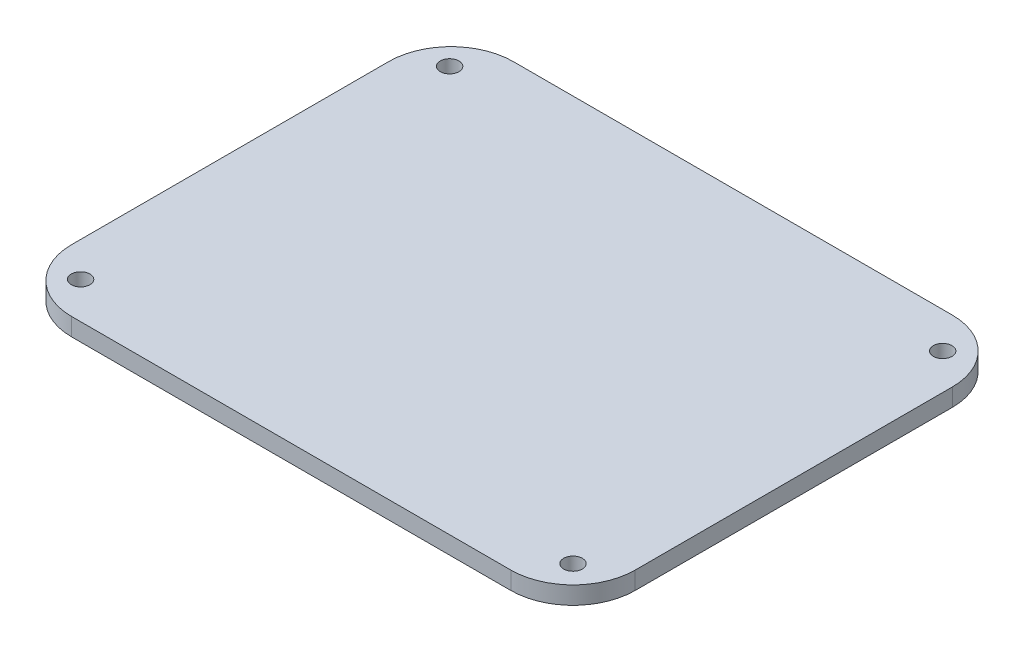
ISO-10303-21;
HEADER;
FILE_DESCRIPTION(('STEP AP214'),'2;1');
FILE_NAME('part.step','',(''),(''),'','','');
FILE_SCHEMA(('AUTOMOTIVE_DESIGN { 1 0 10303 214 1 1 1 1 }'));
ENDSEC;
DATA;
#1=APPLICATION_CONTEXT('core data for automotive mechanical design processes');
#2=APPLICATION_PROTOCOL_DEFINITION('international standard','automotive_design',2000,#1);
#3=PRODUCT_CONTEXT('',#1,'mechanical');
#4=PRODUCT('Part','Part','',(#3));
#5=PRODUCT_RELATED_PRODUCT_CATEGORY('part','',(#4));
#6=PRODUCT_DEFINITION_FORMATION('','',#4);
#7=PRODUCT_DEFINITION_CONTEXT('part definition',#1,'design');
#8=PRODUCT_DEFINITION('design','',#6,#7);
#9=PRODUCT_DEFINITION_SHAPE('','',#8);
#10=(LENGTH_UNIT() NAMED_UNIT(*) SI_UNIT(.MILLI.,.METRE.));
#11=(NAMED_UNIT(*) PLANE_ANGLE_UNIT() SI_UNIT($,.RADIAN.));
#12=(NAMED_UNIT(*) SI_UNIT($,.STERADIAN.) SOLID_ANGLE_UNIT());
#13=UNCERTAINTY_MEASURE_WITH_UNIT(LENGTH_MEASURE(1.E-05),#10,'distance_accuracy_value','');
#14=(GEOMETRIC_REPRESENTATION_CONTEXT(3) GLOBAL_UNCERTAINTY_ASSIGNED_CONTEXT((#13)) GLOBAL_UNIT_ASSIGNED_CONTEXT((#10,
#11,#12)) REPRESENTATION_CONTEXT('',''));
#15=CARTESIAN_POINT('',(0.,0.,0.));
#16=DIRECTION('',(0.,0.,1.));
#17=DIRECTION('',(1.,0.,0.));
#18=AXIS2_PLACEMENT_3D('',#15,#16,#17);
#19=CARTESIAN_POINT('',(9.,2.56,-54.88));
#20=DIRECTION('',(0.,1.,0.));
#21=DIRECTION('',(0.,0.,1.));
#22=AXIS2_PLACEMENT_3D('',#19,#20,#21);
#23=PLANE('',#22);
#24=CARTESIAN_POINT('',(76.33,2.56,-58.68));
#25=DIRECTION('',(0.,1.,0.));
#26=DIRECTION('',(0.,0.,1.));
#27=AXIS2_PLACEMENT_3D('',#24,#25,#26);
#28=CIRCLE('',#27,1.35000000000001);
#29=CARTESIAN_POINT('',(76.33,2.56,-60.03));
#30=VERTEX_POINT('',#29);
#31=EDGE_CURVE('E188',#30,#30,#28,.T.);
#32=ORIENTED_EDGE('',*,*,#31,.F.);
#33=EDGE_LOOP('',(#32));
#34=FACE_BOUND('',#33,.T.);
#35=CARTESIAN_POINT('',(5.,2.56,-5.3));
#36=DIRECTION('',(0.,1.,0.));
#37=DIRECTION('',(0.,0.,1.));
#38=AXIS2_PLACEMENT_3D('',#35,#36,#37);
#39=CIRCLE('',#38,1.35);
#40=CARTESIAN_POINT('',(5.,2.56,-6.65));
#41=VERTEX_POINT('',#40);
#42=EDGE_CURVE('E134',#41,#41,#39,.T.);
#43=ORIENTED_EDGE('',*,*,#42,.F.);
#44=EDGE_LOOP('',(#43));
#45=FACE_BOUND('',#44,.T.);
#46=CARTESIAN_POINT('',(9.,2.56,-54.88));
#47=DIRECTION('',(0.,1.,0.));
#48=DIRECTION('',(0.,0.,1.));
#49=AXIS2_PLACEMENT_3D('',#46,#47,#48);
#50=CIRCLE('',#49,8.99999999999999);
#51=CARTESIAN_POINT('',(9.,2.56,-63.88));
#52=VERTEX_POINT('',#51);
#53=CARTESIAN_POINT('',(0.,2.56,-54.88));
#54=VERTEX_POINT('',#53);
#55=EDGE_CURVE('E145',#52,#54,#50,.T.);
#56=ORIENTED_EDGE('',*,*,#55,.T.);
#57=DIRECTION('',(0.,0.,1.));
#58=VECTOR('',#57,1.);
#59=CARTESIAN_POINT('',(0.,2.56,-9.));
#60=LINE('',#59,#58);
#61=CARTESIAN_POINT('',(0.,2.56,-9.));
#62=VERTEX_POINT('',#61);
#63=EDGE_CURVE('E93',#54,#62,#60,.T.);
#64=ORIENTED_EDGE('',*,*,#63,.T.);
#65=CARTESIAN_POINT('',(9.,2.56,-9.));
#66=DIRECTION('',(0.,1.,0.));
#67=DIRECTION('',(0.,0.,1.));
#68=AXIS2_PLACEMENT_3D('',#65,#66,#67);
#69=CIRCLE('',#68,9.);
#70=CARTESIAN_POINT('',(9.,2.56,0.));
#71=VERTEX_POINT('',#70);
#72=EDGE_CURVE('E160',#62,#71,#69,.T.);
#73=ORIENTED_EDGE('',*,*,#72,.T.);
#74=DIRECTION('',(1.,0.,0.));
#75=VECTOR('',#74,1.);
#76=CARTESIAN_POINT('',(9.,2.56,0.));
#77=LINE('',#76,#75);
#78=CARTESIAN_POINT('',(72.53,2.56,0.));
#79=VERTEX_POINT('',#78);
#80=EDGE_CURVE('E173',#71,#79,#77,.T.);
#81=ORIENTED_EDGE('',*,*,#80,.T.);
#82=CARTESIAN_POINT('',(72.53,2.56,-9.));
#83=DIRECTION('',(0.,1.,0.));
#84=DIRECTION('',(0.,0.,1.));
#85=AXIS2_PLACEMENT_3D('',#82,#83,#84);
#86=CIRCLE('',#85,9.);
#87=CARTESIAN_POINT('',(81.53,2.56,-9.));
#88=VERTEX_POINT('',#87);
#89=EDGE_CURVE('E112',#79,#88,#86,.T.);
#90=ORIENTED_EDGE('',*,*,#89,.T.);
#91=DIRECTION('',(0.,0.,-1.));
#92=VECTOR('',#91,1.);
#93=CARTESIAN_POINT('',(81.53,2.56,-9.));
#94=LINE('',#93,#92);
#95=CARTESIAN_POINT('',(81.53,2.56,-54.88));
#96=VERTEX_POINT('',#95);
#97=EDGE_CURVE('E106',#88,#96,#94,.T.);
#98=ORIENTED_EDGE('',*,*,#97,.T.);
#99=CARTESIAN_POINT('',(72.53,2.56,-54.88));
#100=DIRECTION('',(0.,1.,0.));
#101=DIRECTION('',(0.,0.,1.));
#102=AXIS2_PLACEMENT_3D('',#99,#100,#101);
#103=CIRCLE('',#102,8.99999999999999);
#104=CARTESIAN_POINT('',(72.53,2.56,-63.88));
#105=VERTEX_POINT('',#104);
#106=EDGE_CURVE('E110',#96,#105,#103,.T.);
#107=ORIENTED_EDGE('',*,*,#106,.T.);
#108=DIRECTION('',(-1.,0.,0.));
#109=VECTOR('',#108,1.);
#110=CARTESIAN_POINT('',(9.,2.56,-63.88));
#111=LINE('',#110,#109);
#112=EDGE_CURVE('E50',#105,#52,#111,.T.);
#113=ORIENTED_EDGE('',*,*,#112,.T.);
#114=EDGE_LOOP('',(#56,#64,#73,#81,#90,#98,#107,#113));
#115=FACE_BOUND('',#114,.T.);
#116=CARTESIAN_POINT('',(5.,2.56,-58.68));
#117=DIRECTION('',(0.,1.,0.));
#118=DIRECTION('',(0.,0.,1.));
#119=AXIS2_PLACEMENT_3D('',#116,#117,#118);
#120=CIRCLE('',#119,1.35);
#121=CARTESIAN_POINT('',(5.,2.56,-60.03));
#122=VERTEX_POINT('',#121);
#123=EDGE_CURVE('E182',#122,#122,#120,.T.);
#124=ORIENTED_EDGE('',*,*,#123,.F.);
#125=EDGE_LOOP('',(#124));
#126=FACE_BOUND('',#125,.T.);
#127=CARTESIAN_POINT('',(76.23,2.56,-5.3));
#128=DIRECTION('',(0.,1.,0.));
#129=DIRECTION('',(0.,0.,1.));
#130=AXIS2_PLACEMENT_3D('',#127,#128,#129);
#131=CIRCLE('',#130,1.35000000000001);
#132=CARTESIAN_POINT('',(76.23,2.56,-6.65000000000001));
#133=VERTEX_POINT('',#132);
#134=EDGE_CURVE('E194',#133,#133,#131,.T.);
#135=ORIENTED_EDGE('',*,*,#134,.F.);
#136=EDGE_LOOP('',(#135));
#137=FACE_BOUND('',#136,.T.);
#138=ADVANCED_FACE('F33',(#34,#45,#115,#126,#137),#23,.T.);
#139=CARTESIAN_POINT('',(9.,0.,-54.88));
#140=DIRECTION('',(0.,1.,0.));
#141=DIRECTION('',(0.,0.,1.));
#142=AXIS2_PLACEMENT_3D('',#139,#140,#141);
#143=PLANE('',#142);
#144=CARTESIAN_POINT('',(9.,0.,-54.88));
#145=DIRECTION('',(0.,1.,0.));
#146=DIRECTION('',(0.,0.,1.));
#147=AXIS2_PLACEMENT_3D('',#144,#145,#146);
#148=CIRCLE('',#147,8.99999999999999);
#149=CARTESIAN_POINT('',(9.,0.,-63.88));
#150=VERTEX_POINT('',#149);
#151=CARTESIAN_POINT('',(0.,0.,-54.88));
#152=VERTEX_POINT('',#151);
#153=EDGE_CURVE('E130',#150,#152,#148,.T.);
#154=ORIENTED_EDGE('',*,*,#153,.F.);
#155=DIRECTION('',(-1.,0.,0.));
#156=VECTOR('',#155,1.);
#157=CARTESIAN_POINT('',(9.,0.,-63.88));
#158=LINE('',#157,#156);
#159=CARTESIAN_POINT('',(72.53,0.,-63.88));
#160=VERTEX_POINT('',#159);
#161=EDGE_CURVE('E85',#160,#150,#158,.T.);
#162=ORIENTED_EDGE('',*,*,#161,.F.);
#163=CARTESIAN_POINT('',(72.53,0.,-54.88));
#164=DIRECTION('',(0.,1.,0.));
#165=DIRECTION('',(0.,0.,1.));
#166=AXIS2_PLACEMENT_3D('',#163,#164,#165);
#167=CIRCLE('',#166,8.99999999999999);
#168=CARTESIAN_POINT('',(81.53,0.,-54.88));
#169=VERTEX_POINT('',#168);
#170=EDGE_CURVE('E79',#169,#160,#167,.T.);
#171=ORIENTED_EDGE('',*,*,#170,.F.);
#172=DIRECTION('',(0.,0.,-1.));
#173=VECTOR('',#172,1.);
#174=CARTESIAN_POINT('',(81.53,0.,-9.));
#175=LINE('',#174,#173);
#176=CARTESIAN_POINT('',(81.53,0.,-9.));
#177=VERTEX_POINT('',#176);
#178=EDGE_CURVE('E120',#177,#169,#175,.T.);
#179=ORIENTED_EDGE('',*,*,#178,.F.);
#180=CARTESIAN_POINT('',(72.53,0.,-9.));
#181=DIRECTION('',(0.,1.,0.));
#182=DIRECTION('',(0.,0.,1.));
#183=AXIS2_PLACEMENT_3D('',#180,#181,#182);
#184=CIRCLE('',#183,9.);
#185=CARTESIAN_POINT('',(72.53,0.,0.));
#186=VERTEX_POINT('',#185);
#187=EDGE_CURVE('E140',#186,#177,#184,.T.);
#188=ORIENTED_EDGE('',*,*,#187,.F.);
#189=DIRECTION('',(1.,0.,0.));
#190=VECTOR('',#189,1.);
#191=CARTESIAN_POINT('',(9.,0.,0.));
#192=LINE('',#191,#190);
#193=CARTESIAN_POINT('',(9.,0.,0.));
#194=VERTEX_POINT('',#193);
#195=EDGE_CURVE('E138',#194,#186,#192,.T.);
#196=ORIENTED_EDGE('',*,*,#195,.F.);
#197=CARTESIAN_POINT('',(9.,0.,-9.));
#198=DIRECTION('',(0.,1.,0.));
#199=DIRECTION('',(0.,0.,1.));
#200=AXIS2_PLACEMENT_3D('',#197,#198,#199);
#201=CIRCLE('',#200,9.);
#202=CARTESIAN_POINT('',(0.,0.,-9.));
#203=VERTEX_POINT('',#202);
#204=EDGE_CURVE('E136',#203,#194,#201,.T.);
#205=ORIENTED_EDGE('',*,*,#204,.F.);
#206=DIRECTION('',(0.,0.,1.));
#207=VECTOR('',#206,1.);
#208=CARTESIAN_POINT('',(0.,0.,-9.));
#209=LINE('',#208,#207);
#210=EDGE_CURVE('E133',#152,#203,#209,.T.);
#211=ORIENTED_EDGE('',*,*,#210,.F.);
#212=EDGE_LOOP('',(#154,#162,#171,#179,#188,#196,#205,#211));
#213=FACE_BOUND('',#212,.T.);
#214=CARTESIAN_POINT('',(5.,0.,-5.3));
#215=DIRECTION('',(0.,1.,0.));
#216=DIRECTION('',(0.,0.,1.));
#217=AXIS2_PLACEMENT_3D('',#214,#215,#216);
#218=CIRCLE('',#217,1.35);
#219=CARTESIAN_POINT('',(5.,0.,-6.65));
#220=VERTEX_POINT('',#219);
#221=EDGE_CURVE('E179',#220,#220,#218,.T.);
#222=ORIENTED_EDGE('',*,*,#221,.T.);
#223=EDGE_LOOP('',(#222));
#224=FACE_BOUND('',#223,.T.);
#225=CARTESIAN_POINT('',(5.,0.,-58.68));
#226=DIRECTION('',(0.,1.,0.));
#227=DIRECTION('',(0.,0.,1.));
#228=AXIS2_PLACEMENT_3D('',#225,#226,#227);
#229=CIRCLE('',#228,1.35);
#230=CARTESIAN_POINT('',(5.,0.,-60.03));
#231=VERTEX_POINT('',#230);
#232=EDGE_CURVE('E185',#231,#231,#229,.T.);
#233=ORIENTED_EDGE('',*,*,#232,.T.);
#234=EDGE_LOOP('',(#233));
#235=FACE_BOUND('',#234,.T.);
#236=CARTESIAN_POINT('',(76.33,0.,-58.68));
#237=DIRECTION('',(0.,1.,0.));
#238=DIRECTION('',(0.,0.,1.));
#239=AXIS2_PLACEMENT_3D('',#236,#237,#238);
#240=CIRCLE('',#239,1.35000000000001);
#241=CARTESIAN_POINT('',(76.33,0.,-60.03));
#242=VERTEX_POINT('',#241);
#243=EDGE_CURVE('E191',#242,#242,#240,.T.);
#244=ORIENTED_EDGE('',*,*,#243,.T.);
#245=EDGE_LOOP('',(#244));
#246=FACE_BOUND('',#245,.T.);
#247=CARTESIAN_POINT('',(76.23,0.,-5.3));
#248=DIRECTION('',(0.,1.,0.));
#249=DIRECTION('',(0.,0.,1.));
#250=AXIS2_PLACEMENT_3D('',#247,#248,#249);
#251=CIRCLE('',#250,1.35000000000001);
#252=CARTESIAN_POINT('',(76.23,0.,-6.65000000000001));
#253=VERTEX_POINT('',#252);
#254=EDGE_CURVE('E197',#253,#253,#251,.T.);
#255=ORIENTED_EDGE('',*,*,#254,.T.);
#256=EDGE_LOOP('',(#255));
#257=FACE_BOUND('',#256,.T.);
#258=ADVANCED_FACE('F164',(#213,#224,#235,#246,#257),#143,.F.);
#259=CARTESIAN_POINT('',(9.,2.56,-54.88));
#260=DIRECTION('',(0.,-1.,0.));
#261=DIRECTION('',(0.,0.,-1.));
#262=AXIS2_PLACEMENT_3D('',#259,#260,#261);
#263=CYLINDRICAL_SURFACE('',#262,8.99999999999999);
#264=ORIENTED_EDGE('',*,*,#153,.T.);
#265=DIRECTION('',(0.,-1.,0.));
#266=VECTOR('',#265,1.);
#267=CARTESIAN_POINT('',(0.,2.56,-54.88));
#268=LINE('',#267,#266);
#269=EDGE_CURVE('E11',#54,#152,#268,.T.);
#270=ORIENTED_EDGE('',*,*,#269,.F.);
#271=ORIENTED_EDGE('',*,*,#55,.F.);
#272=DIRECTION('',(0.,-1.,0.));
#273=VECTOR('',#272,1.);
#274=CARTESIAN_POINT('',(9.,2.56,-63.88));
#275=LINE('',#274,#273);
#276=EDGE_CURVE('E126',#52,#150,#275,.T.);
#277=ORIENTED_EDGE('',*,*,#276,.T.);
#278=EDGE_LOOP('',(#264,#270,#271,#277));
#279=FACE_BOUND('',#278,.T.);
#280=ADVANCED_FACE('F35',(#279),#263,.T.);
#281=CARTESIAN_POINT('',(0.,2.56,-9.));
#282=DIRECTION('',(1.,0.,0.));
#283=DIRECTION('',(0.,0.,-1.));
#284=AXIS2_PLACEMENT_3D('',#281,#282,#283);
#285=PLANE('',#284);
#286=ORIENTED_EDGE('',*,*,#210,.T.);
#287=DIRECTION('',(0.,-1.,0.));
#288=VECTOR('',#287,1.);
#289=CARTESIAN_POINT('',(0.,2.56,-9.));
#290=LINE('',#289,#288);
#291=EDGE_CURVE('E42',#62,#203,#290,.T.);
#292=ORIENTED_EDGE('',*,*,#291,.F.);
#293=ORIENTED_EDGE('',*,*,#63,.F.);
#294=ORIENTED_EDGE('',*,*,#269,.T.);
#295=EDGE_LOOP('',(#286,#292,#293,#294));
#296=FACE_BOUND('',#295,.T.);
#297=ADVANCED_FACE('F231',(#296),#285,.F.);
#298=CARTESIAN_POINT('',(9.,2.56,-9.));
#299=DIRECTION('',(0.,-1.,0.));
#300=DIRECTION('',(0.,0.,-1.));
#301=AXIS2_PLACEMENT_3D('',#298,#299,#300);
#302=CYLINDRICAL_SURFACE('',#301,9.);
#303=ORIENTED_EDGE('',*,*,#204,.T.);
#304=DIRECTION('',(0.,-1.,0.));
#305=VECTOR('',#304,1.);
#306=CARTESIAN_POINT('',(9.,2.56,0.));
#307=LINE('',#306,#305);
#308=EDGE_CURVE('E152',#71,#194,#307,.T.);
#309=ORIENTED_EDGE('',*,*,#308,.F.);
#310=ORIENTED_EDGE('',*,*,#72,.F.);
#311=ORIENTED_EDGE('',*,*,#291,.T.);
#312=EDGE_LOOP('',(#303,#309,#310,#311));
#313=FACE_BOUND('',#312,.T.);
#314=ADVANCED_FACE('F158',(#313),#302,.T.);
#315=CARTESIAN_POINT('',(9.,2.56,0.));
#316=DIRECTION('',(0.,0.,-1.));
#317=DIRECTION('',(-1.,0.,0.));
#318=AXIS2_PLACEMENT_3D('',#315,#316,#317);
#319=PLANE('',#318);
#320=ORIENTED_EDGE('',*,*,#195,.T.);
#321=DIRECTION('',(0.,-1.,0.));
#322=VECTOR('',#321,1.);
#323=CARTESIAN_POINT('',(72.53,2.56,0.));
#324=LINE('',#323,#322);
#325=EDGE_CURVE('E149',#79,#186,#324,.T.);
#326=ORIENTED_EDGE('',*,*,#325,.F.);
#327=ORIENTED_EDGE('',*,*,#80,.F.);
#328=ORIENTED_EDGE('',*,*,#308,.T.);
#329=EDGE_LOOP('',(#320,#326,#327,#328));
#330=FACE_BOUND('',#329,.T.);
#331=ADVANCED_FACE('F169',(#330),#319,.F.);
#332=CARTESIAN_POINT('',(72.53,2.56,-9.));
#333=DIRECTION('',(0.,-1.,0.));
#334=DIRECTION('',(0.,0.,-1.));
#335=AXIS2_PLACEMENT_3D('',#332,#333,#334);
#336=CYLINDRICAL_SURFACE('',#335,9.);
#337=ORIENTED_EDGE('',*,*,#187,.T.);
#338=DIRECTION('',(0.,-1.,0.));
#339=VECTOR('',#338,1.);
#340=CARTESIAN_POINT('',(81.53,2.56,-9.));
#341=LINE('',#340,#339);
#342=EDGE_CURVE('E121',#88,#177,#341,.T.);
#343=ORIENTED_EDGE('',*,*,#342,.F.);
#344=ORIENTED_EDGE('',*,*,#89,.F.);
#345=ORIENTED_EDGE('',*,*,#325,.T.);
#346=EDGE_LOOP('',(#337,#343,#344,#345));
#347=FACE_BOUND('',#346,.T.);
#348=ADVANCED_FACE('F172',(#347),#336,.T.);
#349=CARTESIAN_POINT('',(81.53,2.56,-9.));
#350=DIRECTION('',(-1.,0.,0.));
#351=DIRECTION('',(0.,0.,1.));
#352=AXIS2_PLACEMENT_3D('',#349,#350,#351);
#353=PLANE('',#352);
#354=ORIENTED_EDGE('',*,*,#178,.T.);
#355=DIRECTION('',(0.,-1.,0.));
#356=VECTOR('',#355,1.);
#357=CARTESIAN_POINT('',(81.53,2.56,-54.88));
#358=LINE('',#357,#356);
#359=EDGE_CURVE('E117',#96,#169,#358,.T.);
#360=ORIENTED_EDGE('',*,*,#359,.F.);
#361=ORIENTED_EDGE('',*,*,#97,.F.);
#362=ORIENTED_EDGE('',*,*,#342,.T.);
#363=EDGE_LOOP('',(#354,#360,#361,#362));
#364=FACE_BOUND('',#363,.T.);
#365=ADVANCED_FACE('F118',(#364),#353,.F.);
#366=CARTESIAN_POINT('',(72.53,2.56,-54.88));
#367=DIRECTION('',(0.,-1.,0.));
#368=DIRECTION('',(0.,0.,-1.));
#369=AXIS2_PLACEMENT_3D('',#366,#367,#368);
#370=CYLINDRICAL_SURFACE('',#369,8.99999999999999);
#371=ORIENTED_EDGE('',*,*,#170,.T.);
#372=DIRECTION('',(0.,-1.,0.));
#373=VECTOR('',#372,1.);
#374=CARTESIAN_POINT('',(72.53,2.56,-63.88));
#375=LINE('',#374,#373);
#376=EDGE_CURVE('E122',#105,#160,#375,.T.);
#377=ORIENTED_EDGE('',*,*,#376,.F.);
#378=ORIENTED_EDGE('',*,*,#106,.F.);
#379=ORIENTED_EDGE('',*,*,#359,.T.);
#380=EDGE_LOOP('',(#371,#377,#378,#379));
#381=FACE_BOUND('',#380,.T.);
#382=ADVANCED_FACE('F124',(#381),#370,.T.);
#383=CARTESIAN_POINT('',(9.,2.56,-63.88));
#384=DIRECTION('',(0.,0.,1.));
#385=DIRECTION('',(1.,0.,0.));
#386=AXIS2_PLACEMENT_3D('',#383,#384,#385);
#387=PLANE('',#386);
#388=ORIENTED_EDGE('',*,*,#161,.T.);
#389=ORIENTED_EDGE('',*,*,#276,.F.);
#390=ORIENTED_EDGE('',*,*,#112,.F.);
#391=ORIENTED_EDGE('',*,*,#376,.T.);
#392=EDGE_LOOP('',(#388,#389,#390,#391));
#393=FACE_BOUND('',#392,.T.);
#394=ADVANCED_FACE('F219',(#393),#387,.F.);
#395=CARTESIAN_POINT('',(5.,2.56,-5.3));
#396=DIRECTION('',(0.,-1.,0.));
#397=DIRECTION('',(0.,0.,-1.));
#398=AXIS2_PLACEMENT_3D('',#395,#396,#397);
#399=CYLINDRICAL_SURFACE('',#398,1.35);
#400=CARTESIAN_POINT('',(5.,2.56,-6.65));
#401=CARTESIAN_POINT('',(5.,2.53333333333333,-6.65));
#402=CARTESIAN_POINT('',(5.,2.50666666666667,-6.65));
#403=CARTESIAN_POINT('',(5.,2.45333333333333,-6.65));
#404=CARTESIAN_POINT('',(5.,2.42666666666667,-6.65));
#405=CARTESIAN_POINT('',(5.,2.37333333333333,-6.65));
#406=CARTESIAN_POINT('',(5.,2.34666666666667,-6.65));
#407=CARTESIAN_POINT('',(5.,2.29333333333333,-6.65));
#408=CARTESIAN_POINT('',(5.,2.26666666666667,-6.65));
#409=CARTESIAN_POINT('',(5.,2.21333333333333,-6.65));
#410=CARTESIAN_POINT('',(5.,2.18666666666667,-6.65));
#411=CARTESIAN_POINT('',(5.,2.13333333333333,-6.65));
#412=CARTESIAN_POINT('',(5.,2.10666666666667,-6.65));
#413=CARTESIAN_POINT('',(5.,2.05333333333333,-6.65));
#414=CARTESIAN_POINT('',(5.,2.02666666666667,-6.65));
#415=CARTESIAN_POINT('',(5.,1.97333333333333,-6.65));
#416=CARTESIAN_POINT('',(5.,1.94666666666667,-6.65));
#417=CARTESIAN_POINT('',(5.,1.89333333333333,-6.65));
#418=CARTESIAN_POINT('',(5.,1.86666666666667,-6.65));
#419=CARTESIAN_POINT('',(5.,1.81333333333333,-6.65));
#420=CARTESIAN_POINT('',(5.,1.78666666666667,-6.65));
#421=CARTESIAN_POINT('',(5.,1.73333333333333,-6.65));
#422=CARTESIAN_POINT('',(5.,1.70666666666667,-6.65));
#423=CARTESIAN_POINT('',(5.,1.65333333333333,-6.65));
#424=CARTESIAN_POINT('',(5.,1.62666666666667,-6.65));
#425=CARTESIAN_POINT('',(5.,1.57333333333333,-6.65));
#426=CARTESIAN_POINT('',(5.,1.54666666666667,-6.65));
#427=CARTESIAN_POINT('',(5.,1.49333333333333,-6.65));
#428=CARTESIAN_POINT('',(5.,1.46666666666667,-6.65));
#429=CARTESIAN_POINT('',(5.,1.41333333333333,-6.65));
#430=CARTESIAN_POINT('',(5.,1.38666666666667,-6.65));
#431=CARTESIAN_POINT('',(5.,1.33333333333333,-6.65));
#432=CARTESIAN_POINT('',(5.,1.30666666666667,-6.65));
#433=CARTESIAN_POINT('',(5.,1.25333333333333,-6.65));
#434=CARTESIAN_POINT('',(5.,1.22666666666667,-6.65));
#435=CARTESIAN_POINT('',(5.,1.17333333333333,-6.65));
#436=CARTESIAN_POINT('',(5.,1.14666666666667,-6.65));
#437=CARTESIAN_POINT('',(5.,1.09333333333333,-6.65));
#438=CARTESIAN_POINT('',(5.,1.06666666666667,-6.65));
#439=CARTESIAN_POINT('',(5.,1.01333333333333,-6.65));
#440=CARTESIAN_POINT('',(5.,0.986666666666666,-6.65));
#441=CARTESIAN_POINT('',(5.,0.933333333333333,-6.65));
#442=CARTESIAN_POINT('',(5.,0.906666666666666,-6.65));
#443=CARTESIAN_POINT('',(5.,0.853333333333333,-6.65));
#444=CARTESIAN_POINT('',(5.,0.826666666666666,-6.65));
#445=CARTESIAN_POINT('',(5.,0.773333333333333,-6.65));
#446=CARTESIAN_POINT('',(5.,0.746666666666666,-6.65));
#447=CARTESIAN_POINT('',(5.,0.693333333333333,-6.65));
#448=CARTESIAN_POINT('',(5.,0.666666666666666,-6.65));
#449=CARTESIAN_POINT('',(5.,0.613333333333333,-6.65));
#450=CARTESIAN_POINT('',(5.,0.586666666666667,-6.65));
#451=CARTESIAN_POINT('',(5.,0.533333333333333,-6.65));
#452=CARTESIAN_POINT('',(5.,0.506666666666667,-6.65));
#453=CARTESIAN_POINT('',(5.,0.453333333333333,-6.65));
#454=CARTESIAN_POINT('',(5.,0.426666666666667,-6.65));
#455=CARTESIAN_POINT('',(5.,0.373333333333333,-6.65));
#456=CARTESIAN_POINT('',(5.,0.346666666666667,-6.65));
#457=CARTESIAN_POINT('',(5.,0.293333333333333,-6.65));
#458=CARTESIAN_POINT('',(5.,0.266666666666667,-6.65));
#459=CARTESIAN_POINT('',(5.,0.213333333333333,-6.65));
#460=CARTESIAN_POINT('',(5.,0.186666666666667,-6.65));
#461=CARTESIAN_POINT('',(5.,0.133333333333333,-6.65));
#462=CARTESIAN_POINT('',(5.,0.106666666666667,-6.65));
#463=CARTESIAN_POINT('',(5.,0.0533333333333335,-6.65));
#464=CARTESIAN_POINT('',(5.,0.0266666666666667,-6.65));
#465=CARTESIAN_POINT('',(5.,0.,-6.65));
#466=B_SPLINE_CURVE_WITH_KNOTS('',3,(#400,#401,#402,#403,#404,#405,#406,#407,#408,#409,#410,
#411,#412,#413,#414,#415,#416,#417,#418,#419,#420,#421,#422,#423,#424,#425,#426,#427,#428,#429,
#430,#431,#432,#433,#434,#435,#436,#437,#438,#439,#440,#441,#442,#443,#444,#445,#446,#447,#448,
#449,#450,#451,#452,#453,#454,#455,#456,#457,#458,#459,#460,#461,#462,#463,#464,#465),
.UNSPECIFIED.,.F.,.F.,(4,2,2,2,2,2,2,2,2,2,2,2,2,2,2,2,2,2,2,2,2,2,2,2,2,2,2,2,2,2,2,2,4),(0.,
0.0800000000000002,0.16,0.24,0.32,0.4,0.48,0.56,0.64,0.72,0.8,0.88,0.96,1.04,1.12,1.2,1.28,1.36,
1.44,1.52,1.6,1.68,1.76,1.84,1.92,2.,2.08,2.16,2.24,2.32,2.4,2.48,2.56),.UNSPECIFIED.);
#467=EDGE_CURVE('BSEAM216',#41,#220,#466,.T.);
#468=ORIENTED_EDGE('',*,*,#42,.T.);
#469=ORIENTED_EDGE('',*,*,#221,.F.);
#470=ORIENTED_EDGE('',*,*,#467,.T.);
#471=ORIENTED_EDGE('',*,*,#467,.F.);
#472=EDGE_LOOP('',(#468,#470,#469,#471));
#473=FACE_BOUND('',#472,.T.);
#474=ADVANCED_FACE('F216',(#473),#399,.F.);
#475=CARTESIAN_POINT('',(5.,2.56,-58.68));
#476=DIRECTION('',(0.,-1.,0.));
#477=DIRECTION('',(0.,0.,-1.));
#478=AXIS2_PLACEMENT_3D('',#475,#476,#477);
#479=CYLINDRICAL_SURFACE('',#478,1.35);
#480=CARTESIAN_POINT('',(5.,2.56,-60.03));
#481=CARTESIAN_POINT('',(5.,2.53333333333333,-60.03));
#482=CARTESIAN_POINT('',(5.,2.50666666666667,-60.03));
#483=CARTESIAN_POINT('',(5.,2.45333333333333,-60.03));
#484=CARTESIAN_POINT('',(5.,2.42666666666667,-60.03));
#485=CARTESIAN_POINT('',(5.,2.37333333333333,-60.03));
#486=CARTESIAN_POINT('',(5.,2.34666666666667,-60.03));
#487=CARTESIAN_POINT('',(5.,2.29333333333333,-60.03));
#488=CARTESIAN_POINT('',(5.,2.26666666666667,-60.03));
#489=CARTESIAN_POINT('',(5.,2.21333333333333,-60.03));
#490=CARTESIAN_POINT('',(5.,2.18666666666667,-60.03));
#491=CARTESIAN_POINT('',(5.,2.13333333333333,-60.03));
#492=CARTESIAN_POINT('',(5.,2.10666666666667,-60.03));
#493=CARTESIAN_POINT('',(5.,2.05333333333333,-60.03));
#494=CARTESIAN_POINT('',(5.,2.02666666666667,-60.03));
#495=CARTESIAN_POINT('',(5.,1.97333333333333,-60.03));
#496=CARTESIAN_POINT('',(5.,1.94666666666667,-60.03));
#497=CARTESIAN_POINT('',(5.,1.89333333333333,-60.03));
#498=CARTESIAN_POINT('',(5.,1.86666666666667,-60.03));
#499=CARTESIAN_POINT('',(5.,1.81333333333333,-60.03));
#500=CARTESIAN_POINT('',(5.,1.78666666666667,-60.03));
#501=CARTESIAN_POINT('',(5.,1.73333333333333,-60.03));
#502=CARTESIAN_POINT('',(5.,1.70666666666667,-60.03));
#503=CARTESIAN_POINT('',(5.,1.65333333333333,-60.03));
#504=CARTESIAN_POINT('',(5.,1.62666666666667,-60.03));
#505=CARTESIAN_POINT('',(5.,1.57333333333333,-60.03));
#506=CARTESIAN_POINT('',(5.,1.54666666666667,-60.03));
#507=CARTESIAN_POINT('',(5.,1.49333333333333,-60.03));
#508=CARTESIAN_POINT('',(5.,1.46666666666667,-60.03));
#509=CARTESIAN_POINT('',(5.,1.41333333333333,-60.03));
#510=CARTESIAN_POINT('',(5.,1.38666666666667,-60.03));
#511=CARTESIAN_POINT('',(5.,1.33333333333333,-60.03));
#512=CARTESIAN_POINT('',(5.,1.30666666666667,-60.03));
#513=CARTESIAN_POINT('',(5.,1.25333333333333,-60.03));
#514=CARTESIAN_POINT('',(5.,1.22666666666667,-60.03));
#515=CARTESIAN_POINT('',(5.,1.17333333333333,-60.03));
#516=CARTESIAN_POINT('',(5.,1.14666666666667,-60.03));
#517=CARTESIAN_POINT('',(5.,1.09333333333333,-60.03));
#518=CARTESIAN_POINT('',(5.,1.06666666666667,-60.03));
#519=CARTESIAN_POINT('',(5.,1.01333333333333,-60.03));
#520=CARTESIAN_POINT('',(5.,0.986666666666666,-60.03));
#521=CARTESIAN_POINT('',(5.,0.933333333333333,-60.03));
#522=CARTESIAN_POINT('',(5.,0.906666666666666,-60.03));
#523=CARTESIAN_POINT('',(5.,0.853333333333333,-60.03));
#524=CARTESIAN_POINT('',(5.,0.826666666666666,-60.03));
#525=CARTESIAN_POINT('',(5.,0.773333333333333,-60.03));
#526=CARTESIAN_POINT('',(5.,0.746666666666666,-60.03));
#527=CARTESIAN_POINT('',(5.,0.693333333333333,-60.03));
#528=CARTESIAN_POINT('',(5.,0.666666666666666,-60.03));
#529=CARTESIAN_POINT('',(5.,0.613333333333333,-60.03));
#530=CARTESIAN_POINT('',(5.,0.586666666666667,-60.03));
#531=CARTESIAN_POINT('',(5.,0.533333333333333,-60.03));
#532=CARTESIAN_POINT('',(5.,0.506666666666667,-60.03));
#533=CARTESIAN_POINT('',(5.,0.453333333333333,-60.03));
#534=CARTESIAN_POINT('',(5.,0.426666666666667,-60.03));
#535=CARTESIAN_POINT('',(5.,0.373333333333333,-60.03));
#536=CARTESIAN_POINT('',(5.,0.346666666666667,-60.03));
#537=CARTESIAN_POINT('',(5.,0.293333333333333,-60.03));
#538=CARTESIAN_POINT('',(5.,0.266666666666667,-60.03));
#539=CARTESIAN_POINT('',(5.,0.213333333333333,-60.03));
#540=CARTESIAN_POINT('',(5.,0.186666666666667,-60.03));
#541=CARTESIAN_POINT('',(5.,0.133333333333333,-60.03));
#542=CARTESIAN_POINT('',(5.,0.106666666666667,-60.03));
#543=CARTESIAN_POINT('',(5.,0.0533333333333335,-60.03));
#544=CARTESIAN_POINT('',(5.,0.0266666666666667,-60.03));
#545=CARTESIAN_POINT('',(5.,0.,-60.03));
#546=B_SPLINE_CURVE_WITH_KNOTS('',3,(#480,#481,#482,#483,#484,#485,#486,#487,#488,#489,#490,
#491,#492,#493,#494,#495,#496,#497,#498,#499,#500,#501,#502,#503,#504,#505,#506,#507,#508,#509,
#510,#511,#512,#513,#514,#515,#516,#517,#518,#519,#520,#521,#522,#523,#524,#525,#526,#527,#528,
#529,#530,#531,#532,#533,#534,#535,#536,#537,#538,#539,#540,#541,#542,#543,#544,#545),
.UNSPECIFIED.,.F.,.F.,(4,2,2,2,2,2,2,2,2,2,2,2,2,2,2,2,2,2,2,2,2,2,2,2,2,2,2,2,2,2,2,2,4),(0.,
0.0800000000000002,0.16,0.24,0.32,0.4,0.48,0.56,0.64,0.72,0.8,0.88,0.96,1.04,1.12,1.2,1.28,1.36,
1.44,1.52,1.6,1.68,1.76,1.84,1.92,2.,2.08,2.16,2.24,2.32,2.4,2.48,2.56),.UNSPECIFIED.);
#547=EDGE_CURVE('BSEAM295',#122,#231,#546,.T.);
#548=ORIENTED_EDGE('',*,*,#123,.T.);
#549=ORIENTED_EDGE('',*,*,#232,.F.);
#550=ORIENTED_EDGE('',*,*,#547,.T.);
#551=ORIENTED_EDGE('',*,*,#547,.F.);
#552=EDGE_LOOP('',(#548,#550,#549,#551));
#553=FACE_BOUND('',#552,.T.);
#554=ADVANCED_FACE('F295',(#553),#479,.F.);
#555=CARTESIAN_POINT('',(76.33,2.56,-58.68));
#556=DIRECTION('',(0.,-1.,0.));
#557=DIRECTION('',(0.,0.,-1.));
#558=AXIS2_PLACEMENT_3D('',#555,#556,#557);
#559=CYLINDRICAL_SURFACE('',#558,1.35000000000001);
#560=CARTESIAN_POINT('',(76.33,2.56,-60.03));
#561=CARTESIAN_POINT('',(76.33,2.53333333333333,-60.03));
#562=CARTESIAN_POINT('',(76.33,2.50666666666667,-60.03));
#563=CARTESIAN_POINT('',(76.33,2.45333333333333,-60.03));
#564=CARTESIAN_POINT('',(76.33,2.42666666666667,-60.03));
#565=CARTESIAN_POINT('',(76.33,2.37333333333333,-60.03));
#566=CARTESIAN_POINT('',(76.33,2.34666666666667,-60.03));
#567=CARTESIAN_POINT('',(76.33,2.29333333333333,-60.03));
#568=CARTESIAN_POINT('',(76.33,2.26666666666667,-60.03));
#569=CARTESIAN_POINT('',(76.33,2.21333333333333,-60.03));
#570=CARTESIAN_POINT('',(76.33,2.18666666666667,-60.03));
#571=CARTESIAN_POINT('',(76.33,2.13333333333333,-60.03));
#572=CARTESIAN_POINT('',(76.33,2.10666666666667,-60.03));
#573=CARTESIAN_POINT('',(76.33,2.05333333333333,-60.03));
#574=CARTESIAN_POINT('',(76.33,2.02666666666667,-60.03));
#575=CARTESIAN_POINT('',(76.33,1.97333333333333,-60.03));
#576=CARTESIAN_POINT('',(76.33,1.94666666666667,-60.03));
#577=CARTESIAN_POINT('',(76.33,1.89333333333333,-60.03));
#578=CARTESIAN_POINT('',(76.33,1.86666666666667,-60.03));
#579=CARTESIAN_POINT('',(76.33,1.81333333333333,-60.03));
#580=CARTESIAN_POINT('',(76.33,1.78666666666667,-60.03));
#581=CARTESIAN_POINT('',(76.33,1.73333333333333,-60.03));
#582=CARTESIAN_POINT('',(76.33,1.70666666666667,-60.03));
#583=CARTESIAN_POINT('',(76.33,1.65333333333333,-60.03));
#584=CARTESIAN_POINT('',(76.33,1.62666666666667,-60.03));
#585=CARTESIAN_POINT('',(76.33,1.57333333333333,-60.03));
#586=CARTESIAN_POINT('',(76.33,1.54666666666667,-60.03));
#587=CARTESIAN_POINT('',(76.33,1.49333333333333,-60.03));
#588=CARTESIAN_POINT('',(76.33,1.46666666666667,-60.03));
#589=CARTESIAN_POINT('',(76.33,1.41333333333333,-60.03));
#590=CARTESIAN_POINT('',(76.33,1.38666666666667,-60.03));
#591=CARTESIAN_POINT('',(76.33,1.33333333333333,-60.03));
#592=CARTESIAN_POINT('',(76.33,1.30666666666667,-60.03));
#593=CARTESIAN_POINT('',(76.33,1.25333333333333,-60.03));
#594=CARTESIAN_POINT('',(76.33,1.22666666666667,-60.03));
#595=CARTESIAN_POINT('',(76.33,1.17333333333333,-60.03));
#596=CARTESIAN_POINT('',(76.33,1.14666666666667,-60.03));
#597=CARTESIAN_POINT('',(76.33,1.09333333333333,-60.03));
#598=CARTESIAN_POINT('',(76.33,1.06666666666667,-60.03));
#599=CARTESIAN_POINT('',(76.33,1.01333333333333,-60.03));
#600=CARTESIAN_POINT('',(76.33,0.986666666666666,-60.03));
#601=CARTESIAN_POINT('',(76.33,0.933333333333333,-60.03));
#602=CARTESIAN_POINT('',(76.33,0.906666666666666,-60.03));
#603=CARTESIAN_POINT('',(76.33,0.853333333333333,-60.03));
#604=CARTESIAN_POINT('',(76.33,0.826666666666666,-60.03));
#605=CARTESIAN_POINT('',(76.33,0.773333333333333,-60.03));
#606=CARTESIAN_POINT('',(76.33,0.746666666666666,-60.03));
#607=CARTESIAN_POINT('',(76.33,0.693333333333333,-60.03));
#608=CARTESIAN_POINT('',(76.33,0.666666666666666,-60.03));
#609=CARTESIAN_POINT('',(76.33,0.613333333333333,-60.03));
#610=CARTESIAN_POINT('',(76.33,0.586666666666667,-60.03));
#611=CARTESIAN_POINT('',(76.33,0.533333333333333,-60.03));
#612=CARTESIAN_POINT('',(76.33,0.506666666666667,-60.03));
#613=CARTESIAN_POINT('',(76.33,0.453333333333333,-60.03));
#614=CARTESIAN_POINT('',(76.33,0.426666666666667,-60.03));
#615=CARTESIAN_POINT('',(76.33,0.373333333333333,-60.03));
#616=CARTESIAN_POINT('',(76.33,0.346666666666667,-60.03));
#617=CARTESIAN_POINT('',(76.33,0.293333333333333,-60.03));
#618=CARTESIAN_POINT('',(76.33,0.266666666666667,-60.03));
#619=CARTESIAN_POINT('',(76.33,0.213333333333333,-60.03));
#620=CARTESIAN_POINT('',(76.33,0.186666666666667,-60.03));
#621=CARTESIAN_POINT('',(76.33,0.133333333333333,-60.03));
#622=CARTESIAN_POINT('',(76.33,0.106666666666667,-60.03));
#623=CARTESIAN_POINT('',(76.33,0.0533333333333335,-60.03));
#624=CARTESIAN_POINT('',(76.33,0.0266666666666667,-60.03));
#625=CARTESIAN_POINT('',(76.33,0.,-60.03));
#626=B_SPLINE_CURVE_WITH_KNOTS('',3,(#560,#561,#562,#563,#564,#565,#566,#567,#568,#569,#570,
#571,#572,#573,#574,#575,#576,#577,#578,#579,#580,#581,#582,#583,#584,#585,#586,#587,#588,#589,
#590,#591,#592,#593,#594,#595,#596,#597,#598,#599,#600,#601,#602,#603,#604,#605,#606,#607,#608,
#609,#610,#611,#612,#613,#614,#615,#616,#617,#618,#619,#620,#621,#622,#623,#624,#625),
.UNSPECIFIED.,.F.,.F.,(4,2,2,2,2,2,2,2,2,2,2,2,2,2,2,2,2,2,2,2,2,2,2,2,2,2,2,2,2,2,2,2,4),(0.,
0.0800000000000002,0.16,0.24,0.32,0.4,0.48,0.56,0.64,0.72,0.8,0.88,0.96,1.04,1.12,1.2,1.28,1.36,
1.44,1.52,1.6,1.68,1.76,1.84,1.92,2.,2.08,2.16,2.24,2.32,2.4,2.48,2.56),.UNSPECIFIED.);
#627=EDGE_CURVE('BSEAM303',#30,#242,#626,.T.);
#628=ORIENTED_EDGE('',*,*,#31,.T.);
#629=ORIENTED_EDGE('',*,*,#243,.F.);
#630=ORIENTED_EDGE('',*,*,#627,.T.);
#631=ORIENTED_EDGE('',*,*,#627,.F.);
#632=EDGE_LOOP('',(#628,#630,#629,#631));
#633=FACE_BOUND('',#632,.T.);
#634=ADVANCED_FACE('F303',(#633),#559,.F.);
#635=CARTESIAN_POINT('',(76.23,2.56,-5.3));
#636=DIRECTION('',(0.,-1.,0.));
#637=DIRECTION('',(0.,0.,-1.));
#638=AXIS2_PLACEMENT_3D('',#635,#636,#637);
#639=CYLINDRICAL_SURFACE('',#638,1.35000000000001);
#640=CARTESIAN_POINT('',(76.23,2.56,-6.65000000000001));
#641=CARTESIAN_POINT('',(76.23,2.53333333333333,-6.65000000000001));
#642=CARTESIAN_POINT('',(76.23,2.50666666666667,-6.65000000000001));
#643=CARTESIAN_POINT('',(76.23,2.45333333333333,-6.65000000000001));
#644=CARTESIAN_POINT('',(76.23,2.42666666666667,-6.65000000000001));
#645=CARTESIAN_POINT('',(76.23,2.37333333333333,-6.65000000000001));
#646=CARTESIAN_POINT('',(76.23,2.34666666666667,-6.65000000000001));
#647=CARTESIAN_POINT('',(76.23,2.29333333333333,-6.65000000000001));
#648=CARTESIAN_POINT('',(76.23,2.26666666666667,-6.65000000000001));
#649=CARTESIAN_POINT('',(76.23,2.21333333333333,-6.65000000000001));
#650=CARTESIAN_POINT('',(76.23,2.18666666666667,-6.65000000000001));
#651=CARTESIAN_POINT('',(76.23,2.13333333333333,-6.65000000000001));
#652=CARTESIAN_POINT('',(76.23,2.10666666666667,-6.65000000000001));
#653=CARTESIAN_POINT('',(76.23,2.05333333333333,-6.65000000000001));
#654=CARTESIAN_POINT('',(76.23,2.02666666666667,-6.65000000000001));
#655=CARTESIAN_POINT('',(76.23,1.97333333333333,-6.65000000000001));
#656=CARTESIAN_POINT('',(76.23,1.94666666666667,-6.65000000000001));
#657=CARTESIAN_POINT('',(76.23,1.89333333333333,-6.65000000000001));
#658=CARTESIAN_POINT('',(76.23,1.86666666666667,-6.65000000000001));
#659=CARTESIAN_POINT('',(76.23,1.81333333333333,-6.65000000000001));
#660=CARTESIAN_POINT('',(76.23,1.78666666666667,-6.65000000000001));
#661=CARTESIAN_POINT('',(76.23,1.73333333333333,-6.65000000000001));
#662=CARTESIAN_POINT('',(76.23,1.70666666666667,-6.65000000000001));
#663=CARTESIAN_POINT('',(76.23,1.65333333333333,-6.65000000000001));
#664=CARTESIAN_POINT('',(76.23,1.62666666666667,-6.65000000000001));
#665=CARTESIAN_POINT('',(76.23,1.57333333333333,-6.65000000000001));
#666=CARTESIAN_POINT('',(76.23,1.54666666666667,-6.65000000000001));
#667=CARTESIAN_POINT('',(76.23,1.49333333333333,-6.65000000000001));
#668=CARTESIAN_POINT('',(76.23,1.46666666666667,-6.65000000000001));
#669=CARTESIAN_POINT('',(76.23,1.41333333333333,-6.65000000000001));
#670=CARTESIAN_POINT('',(76.23,1.38666666666667,-6.65000000000001));
#671=CARTESIAN_POINT('',(76.23,1.33333333333333,-6.65000000000001));
#672=CARTESIAN_POINT('',(76.23,1.30666666666667,-6.65000000000001));
#673=CARTESIAN_POINT('',(76.23,1.25333333333333,-6.65000000000001));
#674=CARTESIAN_POINT('',(76.23,1.22666666666667,-6.65000000000001));
#675=CARTESIAN_POINT('',(76.23,1.17333333333333,-6.65000000000001));
#676=CARTESIAN_POINT('',(76.23,1.14666666666667,-6.65000000000001));
#677=CARTESIAN_POINT('',(76.23,1.09333333333333,-6.65000000000001));
#678=CARTESIAN_POINT('',(76.23,1.06666666666667,-6.65000000000001));
#679=CARTESIAN_POINT('',(76.23,1.01333333333333,-6.65000000000001));
#680=CARTESIAN_POINT('',(76.23,0.986666666666666,-6.65000000000001));
#681=CARTESIAN_POINT('',(76.23,0.933333333333333,-6.65000000000001));
#682=CARTESIAN_POINT('',(76.23,0.906666666666666,-6.65000000000001));
#683=CARTESIAN_POINT('',(76.23,0.853333333333333,-6.65000000000001));
#684=CARTESIAN_POINT('',(76.23,0.826666666666666,-6.65000000000001));
#685=CARTESIAN_POINT('',(76.23,0.773333333333333,-6.65000000000001));
#686=CARTESIAN_POINT('',(76.23,0.746666666666666,-6.65000000000001));
#687=CARTESIAN_POINT('',(76.23,0.693333333333333,-6.65000000000001));
#688=CARTESIAN_POINT('',(76.23,0.666666666666666,-6.65000000000001));
#689=CARTESIAN_POINT('',(76.23,0.613333333333333,-6.65000000000001));
#690=CARTESIAN_POINT('',(76.23,0.586666666666667,-6.65000000000001));
#691=CARTESIAN_POINT('',(76.23,0.533333333333333,-6.65000000000001));
#692=CARTESIAN_POINT('',(76.23,0.506666666666667,-6.65000000000001));
#693=CARTESIAN_POINT('',(76.23,0.453333333333333,-6.65000000000001));
#694=CARTESIAN_POINT('',(76.23,0.426666666666667,-6.65000000000001));
#695=CARTESIAN_POINT('',(76.23,0.373333333333333,-6.65000000000001));
#696=CARTESIAN_POINT('',(76.23,0.346666666666667,-6.65000000000001));
#697=CARTESIAN_POINT('',(76.23,0.293333333333333,-6.65000000000001));
#698=CARTESIAN_POINT('',(76.23,0.266666666666667,-6.65000000000001));
#699=CARTESIAN_POINT('',(76.23,0.213333333333333,-6.65000000000001));
#700=CARTESIAN_POINT('',(76.23,0.186666666666667,-6.65000000000001));
#701=CARTESIAN_POINT('',(76.23,0.133333333333333,-6.65000000000001));
#702=CARTESIAN_POINT('',(76.23,0.106666666666667,-6.65000000000001));
#703=CARTESIAN_POINT('',(76.23,0.0533333333333335,-6.65000000000001));
#704=CARTESIAN_POINT('',(76.23,0.0266666666666667,-6.65000000000001));
#705=CARTESIAN_POINT('',(76.23,0.,-6.65000000000001));
#706=B_SPLINE_CURVE_WITH_KNOTS('',3,(#640,#641,#642,#643,#644,#645,#646,#647,#648,#649,#650,
#651,#652,#653,#654,#655,#656,#657,#658,#659,#660,#661,#662,#663,#664,#665,#666,#667,#668,#669,
#670,#671,#672,#673,#674,#675,#676,#677,#678,#679,#680,#681,#682,#683,#684,#685,#686,#687,#688,
#689,#690,#691,#692,#693,#694,#695,#696,#697,#698,#699,#700,#701,#702,#703,#704,#705),
.UNSPECIFIED.,.F.,.F.,(4,2,2,2,2,2,2,2,2,2,2,2,2,2,2,2,2,2,2,2,2,2,2,2,2,2,2,2,2,2,2,2,4),(0.,
0.0800000000000002,0.16,0.24,0.32,0.4,0.48,0.56,0.64,0.72,0.8,0.88,0.96,1.04,1.12,1.2,1.28,1.36,
1.44,1.52,1.6,1.68,1.76,1.84,1.92,2.,2.08,2.16,2.24,2.32,2.4,2.48,2.56),.UNSPECIFIED.);
#707=EDGE_CURVE('BSEAM203',#133,#253,#706,.T.);
#708=ORIENTED_EDGE('',*,*,#134,.T.);
#709=ORIENTED_EDGE('',*,*,#254,.F.);
#710=ORIENTED_EDGE('',*,*,#707,.T.);
#711=ORIENTED_EDGE('',*,*,#707,.F.);
#712=EDGE_LOOP('',(#708,#710,#709,#711));
#713=FACE_BOUND('',#712,.T.);
#714=ADVANCED_FACE('F203',(#713),#639,.F.);
#715=CLOSED_SHELL('',(#138,#258,#280,#297,#314,#331,#348,#365,#382,#394,#474,#554,#634,#714));
#716=MANIFOLD_SOLID_BREP('B2',#715);
#717=ADVANCED_BREP_SHAPE_REPRESENTATION('',(#18,#716),#14);
#718=SHAPE_DEFINITION_REPRESENTATION(#9,#717);
ENDSEC;
END-ISO-10303-21;
